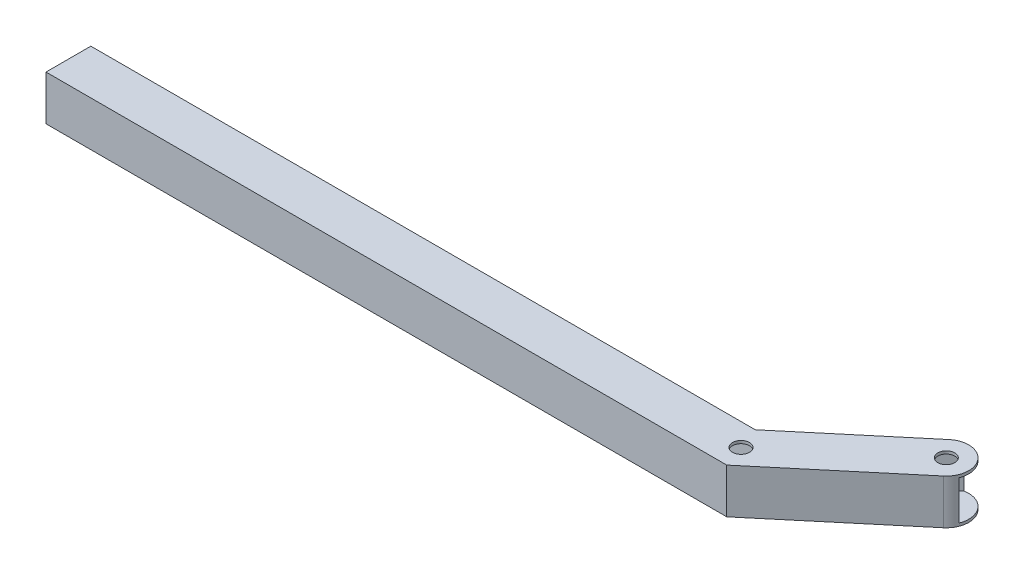
ISO-10303-21;
HEADER;
FILE_DESCRIPTION(('STEP AP214'),'2;1');
FILE_NAME('part.step','',(''),(''),'','','');
FILE_SCHEMA(('AUTOMOTIVE_DESIGN { 1 0 10303 214 1 1 1 1 }'));
ENDSEC;
DATA;
#1=APPLICATION_CONTEXT('core data for automotive mechanical design processes');
#2=APPLICATION_PROTOCOL_DEFINITION('international standard','automotive_design',2000,#1);
#3=PRODUCT_CONTEXT('',#1,'mechanical');
#4=PRODUCT('Part','Part','',(#3));
#5=PRODUCT_RELATED_PRODUCT_CATEGORY('part','',(#4));
#6=PRODUCT_DEFINITION_FORMATION('','',#4);
#7=PRODUCT_DEFINITION_CONTEXT('part definition',#1,'design');
#8=PRODUCT_DEFINITION('design','',#6,#7);
#9=PRODUCT_DEFINITION_SHAPE('','',#8);
#10=(LENGTH_UNIT() NAMED_UNIT(*) SI_UNIT(.MILLI.,.METRE.));
#11=(NAMED_UNIT(*) PLANE_ANGLE_UNIT() SI_UNIT($,.RADIAN.));
#12=(NAMED_UNIT(*) SI_UNIT($,.STERADIAN.) SOLID_ANGLE_UNIT());
#13=UNCERTAINTY_MEASURE_WITH_UNIT(LENGTH_MEASURE(1.E-05),#10,'distance_accuracy_value','');
#14=(GEOMETRIC_REPRESENTATION_CONTEXT(3) GLOBAL_UNCERTAINTY_ASSIGNED_CONTEXT((#13)) GLOBAL_UNIT_ASSIGNED_CONTEXT((#10,
#11,#12)) REPRESENTATION_CONTEXT('',''));
#15=CARTESIAN_POINT('',(0.,0.,0.));
#16=DIRECTION('',(0.,0.,1.));
#17=DIRECTION('',(1.,0.,0.));
#18=AXIS2_PLACEMENT_3D('',#15,#16,#17);
#19=CARTESIAN_POINT('',(390.488969144889,1.5875,-76.929763444575));
#20=DIRECTION('',(0.,-1.,0.));
#21=DIRECTION('',(0.,0.,-1.));
#22=AXIS2_PLACEMENT_3D('',#19,#20,#21);
#23=PLANE('',#22);
#24=CARTESIAN_POINT('',(390.488969144889,1.5875,-76.929763444575));
#25=DIRECTION('',(0.,-1.,0.));
#26=DIRECTION('',(0.,0.,-1.));
#27=AXIS2_PLACEMENT_3D('',#24,#25,#26);
#28=CIRCLE('',#27,4.82599999999999);
#29=CARTESIAN_POINT('',(390.488969144889,1.5875,-81.755763444575));
#30=VERTEX_POINT('',#29);
#31=EDGE_CURVE('E386',#30,#30,#28,.T.);
#32=ORIENTED_EDGE('',*,*,#31,.T.);
#33=EDGE_LOOP('',(#32));
#34=FACE_BOUND('',#33,.T.);
#35=CARTESIAN_POINT('',(327.252000365417,1.5875,-23.8676462649511));
#36=DIRECTION('',(0.,-1.,0.));
#37=DIRECTION('',(0.,0.,-1.));
#38=AXIS2_PLACEMENT_3D('',#35,#36,#37);
#39=CIRCLE('',#38,4.82599999999999);
#40=CARTESIAN_POINT('',(327.252000365417,1.5875,-28.693646264951));
#41=VERTEX_POINT('',#40);
#42=EDGE_CURVE('E175',#41,#41,#39,.T.);
#43=ORIENTED_EDGE('',*,*,#42,.T.);
#44=EDGE_LOOP('',(#43));
#45=FACE_BOUND('',#44,.T.);
#46=DIRECTION('',(-1.,0.,0.));
#47=VECTOR('',#46,1.);
#48=CARTESIAN_POINT('',(-53.7479996345851,1.5875,-12.755146264951));
#49=LINE('',#48,#47);
#50=CARTESIAN_POINT('',(330.542351676102,1.5875,-12.755146264951));
#51=VERTEX_POINT('',#50);
#52=CARTESIAN_POINT('',(-53.7479996345827,1.5875,-12.755146264951));
#53=VERTEX_POINT('',#52);
#54=EDGE_CURVE('E51',#51,#53,#49,.T.);
#55=ORIENTED_EDGE('',*,*,#54,.F.);
#56=DIRECTION('',(-0.642787609686615,0.,-0.766044443118915));
#57=VECTOR('',#56,1.);
#58=CARTESIAN_POINT('',(330.542351676102,1.5875,-12.755146264951));
#59=LINE('',#58,#57);
#60=CARTESIAN_POINT('',(330.853997010219,1.5875,-12.3837418184018));
#61=VERTEX_POINT('',#60);
#62=EDGE_CURVE('E55',#61,#51,#59,.T.);
#63=ORIENTED_EDGE('',*,*,#62,.F.);
#64=DIRECTION('',(-0.766044443118914,0.,0.642787609686616));
#65=VECTOR('',#64,1.);
#66=CARTESIAN_POINT('',(330.853997010219,1.5875,-12.3837418184018));
#67=LINE('',#66,#65);
#68=CARTESIAN_POINT('',(331.2966195937,1.5875,-12.755146264951));
#69=VERTEX_POINT('',#68);
#70=EDGE_CURVE('E213',#69,#61,#67,.T.);
#71=ORIENTED_EDGE('',*,*,#70,.F.);
#72=DIRECTION('',(-1.,0.,0.));
#73=VECTOR('',#72,1.);
#74=CARTESIAN_POINT('',(331.2966195937,1.5875,-12.755146264951));
#75=LINE('',#74,#73);
#76=CARTESIAN_POINT('',(331.874422340594,1.5875,-12.755146264951));
#77=VERTEX_POINT('',#76);
#78=EDGE_CURVE('E210',#77,#69,#75,.T.);
#79=ORIENTED_EDGE('',*,*,#78,.F.);
#80=DIRECTION('',(0.,0.,1.));
#81=VECTOR('',#80,1.);
#82=CARTESIAN_POINT('',(331.874422340594,1.5875,-12.755146264951));
#83=LINE('',#82,#81);
#84=CARTESIAN_POINT('',(331.874422340594,1.5875,-13.2399803367638));
#85=VERTEX_POINT('',#84);
#86=EDGE_CURVE('E185',#85,#77,#83,.T.);
#87=ORIENTED_EDGE('',*,*,#86,.F.);
#88=DIRECTION('',(-0.766044443118915,0.,0.642787609686614));
#89=VECTOR('',#88,1.);
#90=CARTESIAN_POINT('',(331.874422340594,1.5875,-13.2399803367638));
#91=LINE('',#90,#89);
#92=CARTESIAN_POINT('',(402.341864357516,1.5875,-72.3691849431811));
#93=VERTEX_POINT('',#92);
#94=EDGE_CURVE('E192',#93,#85,#91,.T.);
#95=ORIENTED_EDGE('',*,*,#94,.F.);
#96=CARTESIAN_POINT('',(390.488969144889,1.5875,-76.929763444575));
#97=DIRECTION('',(0.,1.,0.));
#98=DIRECTION('',(0.,0.,-1.));
#99=AXIS2_PLACEMENT_3D('',#96,#97,#98);
#100=CIRCLE('',#99,12.7000000468073);
#101=CARTESIAN_POINT('',(388.055909732222,1.5875,-89.3945226914815));
#102=VERTEX_POINT('',#101);
#103=EDGE_CURVE('E260',#93,#102,#100,.T.);
#104=ORIENTED_EDGE('',*,*,#103,.T.);
#105=DIRECTION('',(0.766044443118977,0.,-0.642787609686541));
#106=VECTOR('',#105,1.);
#107=CARTESIAN_POINT('',(388.055909658162,1.5875,-89.3945226293371));
#108=LINE('',#107,#106);
#109=CARTESIAN_POINT('',(323.207381137134,1.5875,-34.9801462649537));
#110=VERTEX_POINT('',#109);
#111=EDGE_CURVE('E239',#110,#102,#108,.T.);
#112=ORIENTED_EDGE('',*,*,#111,.F.);
#113=DIRECTION('',(1.,0.,0.));
#114=VECTOR('',#113,1.);
#115=CARTESIAN_POINT('',(323.207381137134,1.5875,-34.9801462649537));
#116=LINE('',#115,#114);
#117=CARTESIAN_POINT('',(-53.7479996345827,1.5875,-34.9801462649537));
#118=VERTEX_POINT('',#117);
#119=EDGE_CURVE('E244',#118,#110,#116,.T.);
#120=ORIENTED_EDGE('',*,*,#119,.F.);
#121=DIRECTION('',(0.,0.,1.));
#122=VECTOR('',#121,1.);
#123=CARTESIAN_POINT('',(-53.7479996345827,1.5875,-11.167646264951));
#124=LINE('',#123,#122);
#125=EDGE_CURVE('E262',#118,#53,#124,.T.);
#126=ORIENTED_EDGE('',*,*,#125,.T.);
#127=EDGE_LOOP('',(#55,#63,#71,#79,#87,#95,#104,#112,#120,#126));
#128=FACE_BOUND('',#127,.T.);
#129=ADVANCED_FACE('F36',(#34,#45,#128),#23,.F.);
#130=CARTESIAN_POINT('',(390.488969144889,1.5875,-76.929763444575));
#131=DIRECTION('',(0.,-1.,0.));
#132=DIRECTION('',(0.,0.,-1.));
#133=AXIS2_PLACEMENT_3D('',#130,#131,#132);
#134=CYLINDRICAL_SURFACE('',#133,12.7000000468073);
#135=DIRECTION('',(0.,-1.,0.));
#136=VECTOR('',#135,1.);
#137=CARTESIAN_POINT('',(382.325566471783,1.5875,-86.6585279080425));
#138=LINE('',#137,#136);
#139=CARTESIAN_POINT('',(382.325566471783,25.4,-86.6585279080425));
#140=VERTEX_POINT('',#139);
#141=CARTESIAN_POINT('',(382.325566471783,0.,-86.6585279080425));
#142=VERTEX_POINT('',#141);
#143=EDGE_CURVE('E11',#140,#142,#138,.T.);
#144=ORIENTED_EDGE('',*,*,#143,.F.);
#145=CARTESIAN_POINT('',(390.488969144889,25.4,-76.929763444575));
#146=DIRECTION('',(0.,1.,0.));
#147=DIRECTION('',(0.,0.,-1.));
#148=AXIS2_PLACEMENT_3D('',#145,#146,#147);
#149=CIRCLE('',#148,12.7000000468073);
#150=CARTESIAN_POINT('',(398.652371817995,25.4,-67.2009989811076));
#151=VERTEX_POINT('',#150);
#152=EDGE_CURVE('E151',#151,#140,#149,.T.);
#153=ORIENTED_EDGE('',*,*,#152,.F.);
#154=DIRECTION('',(0.,-1.,0.));
#155=VECTOR('',#154,1.);
#156=CARTESIAN_POINT('',(398.652371817995,1.5875,-67.2009989811076));
#157=LINE('',#156,#155);
#158=CARTESIAN_POINT('',(398.652371817995,0.,-67.2009989811076));
#159=VERTEX_POINT('',#158);
#160=EDGE_CURVE('E265',#151,#159,#157,.T.);
#161=ORIENTED_EDGE('',*,*,#160,.T.);
#162=CARTESIAN_POINT('',(390.488969144889,0.,-76.929763444575));
#163=DIRECTION('',(0.,1.,0.));
#164=DIRECTION('',(0.,0.,-1.));
#165=AXIS2_PLACEMENT_3D('',#162,#163,#164);
#166=CIRCLE('',#165,12.7000000468073);
#167=EDGE_CURVE('E153',#159,#142,#166,.T.);
#168=ORIENTED_EDGE('',*,*,#167,.T.);
#169=EDGE_LOOP('',(#144,#153,#161,#168));
#170=FACE_BOUND('',#169,.T.);
#171=CARTESIAN_POINT('',(390.488969144889,23.8125,-76.929763444575));
#172=DIRECTION('',(0.,1.,0.));
#173=DIRECTION('',(0.,0.,-1.));
#174=AXIS2_PLACEMENT_3D('',#171,#172,#173);
#175=CIRCLE('',#174,12.7000000468073);
#176=CARTESIAN_POINT('',(402.341864283442,23.8125,-72.3691848810253));
#177=VERTEX_POINT('',#176);
#178=CARTESIAN_POINT('',(388.055909658162,23.8125,-89.3945226293371));
#179=VERTEX_POINT('',#178);
#180=EDGE_CURVE('E172',#177,#179,#175,.T.);
#181=ORIENTED_EDGE('',*,*,#180,.T.);
#182=DIRECTION('',(0.,-1.,0.));
#183=VECTOR('',#182,1.);
#184=CARTESIAN_POINT('',(388.055909658162,23.8125,-89.3945226293371));
#185=LINE('',#184,#183);
#186=EDGE_CURVE('E257',#179,#102,#185,.T.);
#187=ORIENTED_EDGE('',*,*,#186,.T.);
#188=ORIENTED_EDGE('',*,*,#103,.F.);
#189=DIRECTION('',(0.,-1.,0.));
#190=VECTOR('',#189,1.);
#191=CARTESIAN_POINT('',(402.341864283442,23.8125,-72.3691848810253));
#192=LINE('',#191,#190);
#193=EDGE_CURVE('E221',#177,#93,#192,.T.);
#194=ORIENTED_EDGE('',*,*,#193,.F.);
#195=EDGE_LOOP('',(#181,#187,#188,#194));
#196=FACE_BOUND('',#195,.T.);
#197=ADVANCED_FACE('F38',(#170,#196),#134,.T.);
#198=CARTESIAN_POINT('',(322.629578317417,1.5875,-36.567646264951));
#199=DIRECTION('',(0.642787609686541,0.,0.766044443118976));
#200=DIRECTION('',(0.766044443118977,0.,-0.642787609686541));
#201=AXIS2_PLACEMENT_3D('',#198,#199,#200);
#202=PLANE('',#201);
#203=DIRECTION('',(-0.766044443118977,0.,0.642787609686541));
#204=VECTOR('',#203,1.);
#205=CARTESIAN_POINT('',(322.629578317417,0.,-36.567646264951));
#206=LINE('',#205,#204);
#207=CARTESIAN_POINT('',(322.629578317417,0.,-36.567646264951));
#208=VERTEX_POINT('',#207);
#209=EDGE_CURVE('E267',#142,#208,#206,.T.);
#210=ORIENTED_EDGE('',*,*,#209,.T.);
#211=DIRECTION('',(0.,-1.,0.));
#212=VECTOR('',#211,1.);
#213=CARTESIAN_POINT('',(322.629578317417,1.5875,-36.567646264951));
#214=LINE('',#213,#212);
#215=CARTESIAN_POINT('',(322.629578317417,25.4,-36.567646264951));
#216=VERTEX_POINT('',#215);
#217=EDGE_CURVE('E44',#216,#208,#214,.T.);
#218=ORIENTED_EDGE('',*,*,#217,.F.);
#219=DIRECTION('',(-0.766044443118976,0.,0.642787609686541));
#220=VECTOR('',#219,1.);
#221=CARTESIAN_POINT('',(322.629578317417,25.4,-36.567646264951));
#222=LINE('',#221,#220);
#223=EDGE_CURVE('E156',#140,#216,#222,.T.);
#224=ORIENTED_EDGE('',*,*,#223,.F.);
#225=ORIENTED_EDGE('',*,*,#143,.T.);
#226=EDGE_LOOP('',(#210,#218,#224,#225));
#227=FACE_BOUND('',#226,.T.);
#228=ADVANCED_FACE('F157',(#227),#202,.F.);
#229=CARTESIAN_POINT('',(-53.7479996345827,1.5875,-36.567646264951));
#230=DIRECTION('',(0.,0.,1.));
#231=DIRECTION('',(1.,0.,0.));
#232=AXIS2_PLACEMENT_3D('',#229,#230,#231);
#233=PLANE('',#232);
#234=DIRECTION('',(-1.,0.,0.));
#235=VECTOR('',#234,1.);
#236=CARTESIAN_POINT('',(-53.7479996345827,0.,-36.567646264951));
#237=LINE('',#236,#235);
#238=CARTESIAN_POINT('',(-53.7479996345827,0.,-36.567646264951));
#239=VERTEX_POINT('',#238);
#240=EDGE_CURVE('E269',#208,#239,#237,.T.);
#241=ORIENTED_EDGE('',*,*,#240,.T.);
#242=DIRECTION('',(0.,-1.,0.));
#243=VECTOR('',#242,1.);
#244=CARTESIAN_POINT('',(-53.7479996345827,1.5875,-36.567646264951));
#245=LINE('',#244,#243);
#246=CARTESIAN_POINT('',(-53.7479996345827,25.4,-36.567646264951));
#247=VERTEX_POINT('',#246);
#248=EDGE_CURVE('E283',#247,#239,#245,.T.);
#249=ORIENTED_EDGE('',*,*,#248,.F.);
#250=DIRECTION('',(-1.,0.,0.));
#251=VECTOR('',#250,1.);
#252=CARTESIAN_POINT('',(-53.7479996345827,25.4,-36.567646264951));
#253=LINE('',#252,#251);
#254=EDGE_CURVE('E162',#216,#247,#253,.T.);
#255=ORIENTED_EDGE('',*,*,#254,.F.);
#256=ORIENTED_EDGE('',*,*,#217,.T.);
#257=EDGE_LOOP('',(#241,#249,#255,#256));
#258=FACE_BOUND('',#257,.T.);
#259=ADVANCED_FACE('F287',(#258),#233,.F.);
#260=CARTESIAN_POINT('',(-53.7479996345827,1.5875,-11.167646264951));
#261=DIRECTION('',(1.,0.,0.));
#262=DIRECTION('',(0.,0.,-1.));
#263=AXIS2_PLACEMENT_3D('',#260,#261,#262);
#264=PLANE('',#263);
#265=DIRECTION('',(0.,-1.,0.));
#266=VECTOR('',#265,1.);
#267=CARTESIAN_POINT('',(-53.7479996345828,23.8125,-34.9801462649537));
#268=LINE('',#267,#266);
#269=CARTESIAN_POINT('',(-53.7479996345827,23.8125,-34.9801462649537));
#270=VERTEX_POINT('',#269);
#271=EDGE_CURVE('E254',#270,#118,#268,.T.);
#272=ORIENTED_EDGE('',*,*,#271,.F.);
#273=DIRECTION('',(0.,0.,1.));
#274=VECTOR('',#273,1.);
#275=CARTESIAN_POINT('',(-53.7479996345827,23.8125,-11.167646264951));
#276=LINE('',#275,#274);
#277=CARTESIAN_POINT('',(-53.7479996345851,23.8125,-12.755146264951));
#278=VERTEX_POINT('',#277);
#279=EDGE_CURVE('E169',#270,#278,#276,.T.);
#280=ORIENTED_EDGE('',*,*,#279,.T.);
#281=DIRECTION('',(0.,-1.,0.));
#282=VECTOR('',#281,1.);
#283=CARTESIAN_POINT('',(-53.7479996345851,23.8125,-12.755146264951));
#284=LINE('',#283,#282);
#285=EDGE_CURVE('E224',#278,#53,#284,.T.);
#286=ORIENTED_EDGE('',*,*,#285,.T.);
#287=ORIENTED_EDGE('',*,*,#125,.F.);
#288=EDGE_LOOP('',(#272,#280,#286,#287));
#289=FACE_BOUND('',#288,.T.);
#290=DIRECTION('',(0.,0.,1.));
#291=VECTOR('',#290,1.);
#292=CARTESIAN_POINT('',(-53.7479996345827,0.,-11.167646264951));
#293=LINE('',#292,#291);
#294=CARTESIAN_POINT('',(-53.7479996345827,0.,-11.167646264951));
#295=VERTEX_POINT('',#294);
#296=EDGE_CURVE('E271',#239,#295,#293,.T.);
#297=ORIENTED_EDGE('',*,*,#296,.T.);
#298=DIRECTION('',(0.,-1.,0.));
#299=VECTOR('',#298,1.);
#300=CARTESIAN_POINT('',(-53.7479996345827,1.5875,-11.167646264951));
#301=LINE('',#300,#299);
#302=CARTESIAN_POINT('',(-53.7479996345827,25.4,-11.167646264951));
#303=VERTEX_POINT('',#302);
#304=EDGE_CURVE('E280',#303,#295,#301,.T.);
#305=ORIENTED_EDGE('',*,*,#304,.F.);
#306=DIRECTION('',(0.,0.,1.));
#307=VECTOR('',#306,1.);
#308=CARTESIAN_POINT('',(-53.7479996345827,25.4,-11.167646264951));
#309=LINE('',#308,#307);
#310=EDGE_CURVE('E179',#247,#303,#309,.T.);
#311=ORIENTED_EDGE('',*,*,#310,.F.);
#312=ORIENTED_EDGE('',*,*,#248,.T.);
#313=EDGE_LOOP('',(#297,#305,#311,#312));
#314=FACE_BOUND('',#313,.T.);
#315=ADVANCED_FACE('F294',(#289,#314),#264,.F.);
#316=CARTESIAN_POINT('',(331.874422413417,1.5875,-11.1676462649511));
#317=DIRECTION('',(0.,0.,-1.));
#318=DIRECTION('',(-1.,0.,0.));
#319=AXIS2_PLACEMENT_3D('',#316,#317,#318);
#320=PLANE('',#319);
#321=DIRECTION('',(1.,0.,0.));
#322=VECTOR('',#321,1.);
#323=CARTESIAN_POINT('',(331.874422413417,0.,-11.1676462649511));
#324=LINE('',#323,#322);
#325=CARTESIAN_POINT('',(331.874422413417,0.,-11.1676462649511));
#326=VERTEX_POINT('',#325);
#327=EDGE_CURVE('E273',#295,#326,#324,.T.);
#328=ORIENTED_EDGE('',*,*,#327,.T.);
#329=DIRECTION('',(0.,-1.,0.));
#330=VECTOR('',#329,1.);
#331=CARTESIAN_POINT('',(331.874422413417,1.5875,-11.1676462649511));
#332=LINE('',#331,#330);
#333=CARTESIAN_POINT('',(331.874422413417,25.4,-11.1676462649511));
#334=VERTEX_POINT('',#333);
#335=EDGE_CURVE('E277',#334,#326,#332,.T.);
#336=ORIENTED_EDGE('',*,*,#335,.F.);
#337=DIRECTION('',(1.,0.,0.));
#338=VECTOR('',#337,1.);
#339=CARTESIAN_POINT('',(331.874422413417,25.4,-11.1676462649511));
#340=LINE('',#339,#338);
#341=EDGE_CURVE('E182',#303,#334,#340,.T.);
#342=ORIENTED_EDGE('',*,*,#341,.F.);
#343=ORIENTED_EDGE('',*,*,#304,.T.);
#344=EDGE_LOOP('',(#328,#336,#342,#343));
#345=FACE_BOUND('',#344,.T.);
#346=ADVANCED_FACE('F298',(#345),#320,.F.);
#347=CARTESIAN_POINT('',(331.874422413417,1.5875,-11.1676462649511));
#348=DIRECTION('',(-0.642787609686541,0.,-0.766044443118976));
#349=DIRECTION('',(-0.766044443118977,0.,0.642787609686541));
#350=AXIS2_PLACEMENT_3D('',#347,#348,#349);
#351=PLANE('',#350);
#352=DIRECTION('',(0.766044443118976,0.,-0.642787609686541));
#353=VECTOR('',#352,1.);
#354=CARTESIAN_POINT('',(331.874422413417,0.,-11.1676462649511));
#355=LINE('',#354,#353);
#356=EDGE_CURVE('E263',#326,#159,#355,.T.);
#357=ORIENTED_EDGE('',*,*,#356,.T.);
#358=ORIENTED_EDGE('',*,*,#160,.F.);
#359=DIRECTION('',(0.766044443118977,0.,-0.642787609686541));
#360=VECTOR('',#359,1.);
#361=CARTESIAN_POINT('',(331.874422413417,25.4,-11.1676462649511));
#362=LINE('',#361,#360);
#363=EDGE_CURVE('E168',#334,#151,#362,.T.);
#364=ORIENTED_EDGE('',*,*,#363,.F.);
#365=ORIENTED_EDGE('',*,*,#335,.T.);
#366=EDGE_LOOP('',(#357,#358,#364,#365));
#367=FACE_BOUND('',#366,.T.);
#368=ADVANCED_FACE('F300',(#367),#351,.F.);
#369=CARTESIAN_POINT('',(390.488969144889,0.,-76.929763444575));
#370=DIRECTION('',(0.,-1.,0.));
#371=DIRECTION('',(0.,0.,-1.));
#372=AXIS2_PLACEMENT_3D('',#369,#370,#371);
#373=PLANE('',#372);
#374=CARTESIAN_POINT('',(390.488969144889,0.,-76.929763444575));
#375=DIRECTION('',(0.,1.,0.));
#376=DIRECTION('',(0.,0.,1.));
#377=AXIS2_PLACEMENT_3D('',#374,#375,#376);
#378=CIRCLE('',#377,4.82599999999999);
#379=CARTESIAN_POINT('',(390.488969144889,0.,-72.1037634445751));
#380=VERTEX_POINT('',#379);
#381=EDGE_CURVE('E380',#380,#380,#378,.T.);
#382=ORIENTED_EDGE('',*,*,#381,.T.);
#383=EDGE_LOOP('',(#382));
#384=FACE_BOUND('',#383,.T.);
#385=CARTESIAN_POINT('',(327.252000365417,0.,-23.8676462649511));
#386=DIRECTION('',(0.,1.,0.));
#387=DIRECTION('',(0.,0.,1.));
#388=AXIS2_PLACEMENT_3D('',#385,#386,#387);
#389=CIRCLE('',#388,4.82599999999999);
#390=CARTESIAN_POINT('',(327.252000365417,0.,-19.0416462649511));
#391=VERTEX_POINT('',#390);
#392=EDGE_CURVE('E389',#391,#391,#389,.T.);
#393=ORIENTED_EDGE('',*,*,#392,.T.);
#394=EDGE_LOOP('',(#393));
#395=FACE_BOUND('',#394,.T.);
#396=ORIENTED_EDGE('',*,*,#167,.F.);
#397=ORIENTED_EDGE('',*,*,#356,.F.);
#398=ORIENTED_EDGE('',*,*,#327,.F.);
#399=ORIENTED_EDGE('',*,*,#296,.F.);
#400=ORIENTED_EDGE('',*,*,#240,.F.);
#401=ORIENTED_EDGE('',*,*,#209,.F.);
#402=EDGE_LOOP('',(#396,#397,#398,#399,#400,#401));
#403=FACE_BOUND('',#402,.T.);
#404=ADVANCED_FACE('F290',(#384,#395,#403),#373,.T.);
#405=CARTESIAN_POINT('',(388.055909658162,23.8125,-89.3945226293371));
#406=DIRECTION('',(-0.642787609686541,0.,-0.766044443118977));
#407=DIRECTION('',(-0.766044443118977,0.,0.642787609686541));
#408=AXIS2_PLACEMENT_3D('',#405,#406,#407);
#409=PLANE('',#408);
#410=ORIENTED_EDGE('',*,*,#111,.T.);
#411=ORIENTED_EDGE('',*,*,#186,.F.);
#412=DIRECTION('',(0.766044443118977,0.,-0.642787609686541));
#413=VECTOR('',#412,1.);
#414=CARTESIAN_POINT('',(388.055909658162,23.8125,-89.3945226293371));
#415=LINE('',#414,#413);
#416=CARTESIAN_POINT('',(323.207381137134,23.8125,-34.9801462649537));
#417=VERTEX_POINT('',#416);
#418=EDGE_CURVE('E240',#417,#179,#415,.T.);
#419=ORIENTED_EDGE('',*,*,#418,.F.);
#420=DIRECTION('',(0.,-1.,0.));
#421=VECTOR('',#420,1.);
#422=CARTESIAN_POINT('',(323.207381137134,23.8125,-34.9801462649537));
#423=LINE('',#422,#421);
#424=EDGE_CURVE('E247',#417,#110,#423,.T.);
#425=ORIENTED_EDGE('',*,*,#424,.T.);
#426=EDGE_LOOP('',(#410,#411,#419,#425));
#427=FACE_BOUND('',#426,.T.);
#428=ADVANCED_FACE('F307',(#427),#409,.F.);
#429=CARTESIAN_POINT('',(323.207381137134,23.8125,-34.9801462649537));
#430=DIRECTION('',(0.,0.,-1.));
#431=DIRECTION('',(-1.,0.,0.));
#432=AXIS2_PLACEMENT_3D('',#429,#430,#431);
#433=PLANE('',#432);
#434=ORIENTED_EDGE('',*,*,#119,.T.);
#435=ORIENTED_EDGE('',*,*,#424,.F.);
#436=DIRECTION('',(1.,0.,0.));
#437=VECTOR('',#436,1.);
#438=CARTESIAN_POINT('',(323.207381137134,23.8125,-34.9801462649537));
#439=LINE('',#438,#437);
#440=EDGE_CURVE('E243',#270,#417,#439,.T.);
#441=ORIENTED_EDGE('',*,*,#440,.F.);
#442=ORIENTED_EDGE('',*,*,#271,.T.);
#443=EDGE_LOOP('',(#434,#435,#441,#442));
#444=FACE_BOUND('',#443,.T.);
#445=ADVANCED_FACE('F322',(#444),#433,.F.);
#446=CARTESIAN_POINT('',(331.874422340594,23.8125,-12.755146264951));
#447=DIRECTION('',(1.,0.,0.));
#448=DIRECTION('',(0.,0.,-1.));
#449=AXIS2_PLACEMENT_3D('',#446,#447,#448);
#450=PLANE('',#449);
#451=ORIENTED_EDGE('',*,*,#86,.T.);
#452=DIRECTION('',(0.,-1.,0.));
#453=VECTOR('',#452,1.);
#454=CARTESIAN_POINT('',(331.874422340594,23.8125,-12.755146264951));
#455=LINE('',#454,#453);
#456=CARTESIAN_POINT('',(331.874422340594,23.8125,-12.755146264951));
#457=VERTEX_POINT('',#456);
#458=EDGE_CURVE('E236',#457,#77,#455,.T.);
#459=ORIENTED_EDGE('',*,*,#458,.F.);
#460=DIRECTION('',(0.,0.,1.));
#461=VECTOR('',#460,1.);
#462=CARTESIAN_POINT('',(331.874422340594,23.8125,-12.755146264951));
#463=LINE('',#462,#461);
#464=CARTESIAN_POINT('',(331.874422340594,23.8125,-13.2399803367638));
#465=VERTEX_POINT('',#464);
#466=EDGE_CURVE('E188',#465,#457,#463,.T.);
#467=ORIENTED_EDGE('',*,*,#466,.F.);
#468=DIRECTION('',(0.,-1.,0.));
#469=VECTOR('',#468,1.);
#470=CARTESIAN_POINT('',(331.874422340594,23.8125,-13.2399803367638));
#471=LINE('',#470,#469);
#472=EDGE_CURVE('E207',#465,#85,#471,.T.);
#473=ORIENTED_EDGE('',*,*,#472,.T.);
#474=EDGE_LOOP('',(#451,#459,#467,#473));
#475=FACE_BOUND('',#474,.T.);
#476=ADVANCED_FACE('F326',(#475),#450,.F.);
#477=CARTESIAN_POINT('',(331.2966195937,23.8125,-12.755146264951));
#478=DIRECTION('',(0.,0.,1.));
#479=DIRECTION('',(1.,0.,0.));
#480=AXIS2_PLACEMENT_3D('',#477,#478,#479);
#481=PLANE('',#480);
#482=ORIENTED_EDGE('',*,*,#78,.T.);
#483=DIRECTION('',(0.,-1.,0.));
#484=VECTOR('',#483,1.);
#485=CARTESIAN_POINT('',(331.2966195937,23.8125,-12.755146264951));
#486=LINE('',#485,#484);
#487=CARTESIAN_POINT('',(331.2966195937,23.8125,-12.755146264951));
#488=VERTEX_POINT('',#487);
#489=EDGE_CURVE('E233',#488,#69,#486,.T.);
#490=ORIENTED_EDGE('',*,*,#489,.F.);
#491=DIRECTION('',(-1.,0.,0.));
#492=VECTOR('',#491,1.);
#493=CARTESIAN_POINT('',(331.2966195937,23.8125,-12.755146264951));
#494=LINE('',#493,#492);
#495=EDGE_CURVE('E191',#457,#488,#494,.T.);
#496=ORIENTED_EDGE('',*,*,#495,.F.);
#497=ORIENTED_EDGE('',*,*,#458,.T.);
#498=EDGE_LOOP('',(#482,#490,#496,#497));
#499=FACE_BOUND('',#498,.T.);
#500=ADVANCED_FACE('F330',(#499),#481,.F.);
#501=CARTESIAN_POINT('',(330.853997010219,23.8125,-12.3837418184018));
#502=DIRECTION('',(0.642787609686616,0.,0.766044443118914));
#503=DIRECTION('',(0.766044443118914,0.,-0.642787609686616));
#504=AXIS2_PLACEMENT_3D('',#501,#502,#503);
#505=PLANE('',#504);
#506=ORIENTED_EDGE('',*,*,#70,.T.);
#507=DIRECTION('',(0.,-1.,0.));
#508=VECTOR('',#507,1.);
#509=CARTESIAN_POINT('',(330.853997010219,23.8125,-12.3837418184018));
#510=LINE('',#509,#508);
#511=CARTESIAN_POINT('',(330.853997010219,23.8125,-12.3837418184018));
#512=VERTEX_POINT('',#511);
#513=EDGE_CURVE('E230',#512,#61,#510,.T.);
#514=ORIENTED_EDGE('',*,*,#513,.F.);
#515=DIRECTION('',(-0.766044443118914,0.,0.642787609686616));
#516=VECTOR('',#515,1.);
#517=CARTESIAN_POINT('',(330.853997010219,23.8125,-12.3837418184018));
#518=LINE('',#517,#516);
#519=EDGE_CURVE('E195',#488,#512,#518,.T.);
#520=ORIENTED_EDGE('',*,*,#519,.F.);
#521=ORIENTED_EDGE('',*,*,#489,.T.);
#522=EDGE_LOOP('',(#506,#514,#520,#521));
#523=FACE_BOUND('',#522,.T.);
#524=ADVANCED_FACE('F334',(#523),#505,.F.);
#525=CARTESIAN_POINT('',(330.542351676102,23.8125,-12.755146264951));
#526=DIRECTION('',(-0.766044443118915,0.,0.642787609686615));
#527=DIRECTION('',(0.642787609686615,0.,0.766044443118915));
#528=AXIS2_PLACEMENT_3D('',#525,#526,#527);
#529=PLANE('',#528);
#530=ORIENTED_EDGE('',*,*,#62,.T.);
#531=DIRECTION('',(0.,-1.,0.));
#532=VECTOR('',#531,1.);
#533=CARTESIAN_POINT('',(330.542351676102,23.8125,-12.755146264951));
#534=LINE('',#533,#532);
#535=CARTESIAN_POINT('',(330.542351676102,23.8125,-12.755146264951));
#536=VERTEX_POINT('',#535);
#537=EDGE_CURVE('E227',#536,#51,#534,.T.);
#538=ORIENTED_EDGE('',*,*,#537,.F.);
#539=DIRECTION('',(-0.642787609686615,0.,-0.766044443118915));
#540=VECTOR('',#539,1.);
#541=CARTESIAN_POINT('',(330.542351676102,23.8125,-12.755146264951));
#542=LINE('',#541,#540);
#543=EDGE_CURVE('E198',#512,#536,#542,.T.);
#544=ORIENTED_EDGE('',*,*,#543,.F.);
#545=ORIENTED_EDGE('',*,*,#513,.T.);
#546=EDGE_LOOP('',(#530,#538,#544,#545));
#547=FACE_BOUND('',#546,.T.);
#548=ADVANCED_FACE('F338',(#547),#529,.F.);
#549=CARTESIAN_POINT('',(-53.7479996345851,23.8125,-12.755146264951));
#550=DIRECTION('',(0.,0.,1.));
#551=DIRECTION('',(1.,0.,0.));
#552=AXIS2_PLACEMENT_3D('',#549,#550,#551);
#553=PLANE('',#552);
#554=ORIENTED_EDGE('',*,*,#54,.T.);
#555=ORIENTED_EDGE('',*,*,#285,.F.);
#556=DIRECTION('',(-1.,0.,0.));
#557=VECTOR('',#556,1.);
#558=CARTESIAN_POINT('',(-53.7479996345851,23.8125,-12.755146264951));
#559=LINE('',#558,#557);
#560=EDGE_CURVE('E201',#536,#278,#559,.T.);
#561=ORIENTED_EDGE('',*,*,#560,.F.);
#562=ORIENTED_EDGE('',*,*,#537,.T.);
#563=EDGE_LOOP('',(#554,#555,#561,#562));
#564=FACE_BOUND('',#563,.T.);
#565=ADVANCED_FACE('F342',(#564),#553,.F.);
#566=CARTESIAN_POINT('',(331.874422340594,23.8125,-13.2399803367638));
#567=DIRECTION('',(0.642787609686614,0.,0.766044443118915));
#568=DIRECTION('',(0.766044443118915,0.,-0.642787609686614));
#569=AXIS2_PLACEMENT_3D('',#566,#567,#568);
#570=PLANE('',#569);
#571=ORIENTED_EDGE('',*,*,#94,.T.);
#572=ORIENTED_EDGE('',*,*,#472,.F.);
#573=DIRECTION('',(-0.766044443118915,0.,0.642787609686614));
#574=VECTOR('',#573,1.);
#575=CARTESIAN_POINT('',(331.874422340594,23.8125,-13.2399803367638));
#576=LINE('',#575,#574);
#577=EDGE_CURVE('E204',#177,#465,#576,.T.);
#578=ORIENTED_EDGE('',*,*,#577,.F.);
#579=ORIENTED_EDGE('',*,*,#193,.T.);
#580=EDGE_LOOP('',(#571,#572,#578,#579));
#581=FACE_BOUND('',#580,.T.);
#582=ADVANCED_FACE('F346',(#581),#570,.F.);
#583=CARTESIAN_POINT('',(390.488969144889,23.8125,-76.929763444575));
#584=DIRECTION('',(0.,-1.,0.));
#585=DIRECTION('',(0.,0.,-1.));
#586=AXIS2_PLACEMENT_3D('',#583,#584,#585);
#587=PLANE('',#586);
#588=CARTESIAN_POINT('',(390.488969144889,23.8125,-76.929763444575));
#589=DIRECTION('',(0.,-1.,0.));
#590=DIRECTION('',(0.,0.,-1.));
#591=AXIS2_PLACEMENT_3D('',#588,#589,#590);
#592=CIRCLE('',#591,4.82599999999999);
#593=CARTESIAN_POINT('',(390.488969144889,23.8125,-81.755763444575));
#594=VERTEX_POINT('',#593);
#595=EDGE_CURVE('E376',#594,#594,#592,.T.);
#596=ORIENTED_EDGE('',*,*,#595,.F.);
#597=EDGE_LOOP('',(#596));
#598=FACE_BOUND('',#597,.T.);
#599=CARTESIAN_POINT('',(327.252000365417,23.8125,-23.8676462649511));
#600=DIRECTION('',(0.,-1.,0.));
#601=DIRECTION('',(0.,0.,-1.));
#602=AXIS2_PLACEMENT_3D('',#599,#600,#601);
#603=CIRCLE('',#602,4.82599999999999);
#604=CARTESIAN_POINT('',(327.252000365417,23.8125,-28.693646264951));
#605=VERTEX_POINT('',#604);
#606=EDGE_CURVE('E392',#605,#605,#603,.T.);
#607=ORIENTED_EDGE('',*,*,#606,.F.);
#608=EDGE_LOOP('',(#607));
#609=FACE_BOUND('',#608,.T.);
#610=ORIENTED_EDGE('',*,*,#418,.T.);
#611=ORIENTED_EDGE('',*,*,#180,.F.);
#612=ORIENTED_EDGE('',*,*,#577,.T.);
#613=ORIENTED_EDGE('',*,*,#466,.T.);
#614=ORIENTED_EDGE('',*,*,#495,.T.);
#615=ORIENTED_EDGE('',*,*,#519,.T.);
#616=ORIENTED_EDGE('',*,*,#543,.T.);
#617=ORIENTED_EDGE('',*,*,#560,.T.);
#618=ORIENTED_EDGE('',*,*,#279,.F.);
#619=ORIENTED_EDGE('',*,*,#440,.T.);
#620=EDGE_LOOP('',(#610,#611,#612,#613,#614,#615,#616,#617,#618,#619));
#621=FACE_BOUND('',#620,.T.);
#622=ADVANCED_FACE('F350',(#598,#609,#621),#587,.T.);
#623=CARTESIAN_POINT('',(390.488969144889,25.4,-76.929763444575));
#624=DIRECTION('',(0.,-1.,0.));
#625=DIRECTION('',(0.,0.,-1.));
#626=AXIS2_PLACEMENT_3D('',#623,#624,#625);
#627=PLANE('',#626);
#628=CARTESIAN_POINT('',(390.488969144889,25.4,-76.929763444575));
#629=DIRECTION('',(0.,1.,0.));
#630=DIRECTION('',(0.,0.,1.));
#631=AXIS2_PLACEMENT_3D('',#628,#629,#630);
#632=CIRCLE('',#631,4.82599999999999);
#633=CARTESIAN_POINT('',(390.488969144889,25.4,-72.1037634445751));
#634=VERTEX_POINT('',#633);
#635=EDGE_CURVE('E379',#634,#634,#632,.T.);
#636=ORIENTED_EDGE('',*,*,#635,.F.);
#637=EDGE_LOOP('',(#636));
#638=FACE_BOUND('',#637,.T.);
#639=CARTESIAN_POINT('',(327.252000365417,25.4,-23.8676462649511));
#640=DIRECTION('',(0.,1.,0.));
#641=DIRECTION('',(0.,0.,1.));
#642=AXIS2_PLACEMENT_3D('',#639,#640,#641);
#643=CIRCLE('',#642,4.82599999999999);
#644=CARTESIAN_POINT('',(327.252000365417,25.4,-19.0416462649511));
#645=VERTEX_POINT('',#644);
#646=EDGE_CURVE('E388',#645,#645,#643,.T.);
#647=ORIENTED_EDGE('',*,*,#646,.F.);
#648=EDGE_LOOP('',(#647));
#649=FACE_BOUND('',#648,.T.);
#650=ORIENTED_EDGE('',*,*,#152,.T.);
#651=ORIENTED_EDGE('',*,*,#223,.T.);
#652=ORIENTED_EDGE('',*,*,#254,.T.);
#653=ORIENTED_EDGE('',*,*,#310,.T.);
#654=ORIENTED_EDGE('',*,*,#341,.T.);
#655=ORIENTED_EDGE('',*,*,#363,.T.);
#656=EDGE_LOOP('',(#650,#651,#652,#653,#654,#655));
#657=FACE_BOUND('',#656,.T.);
#658=ADVANCED_FACE('F165',(#638,#649,#657),#627,.F.);
#659=CARTESIAN_POINT('',(327.252000365417,0.,-23.8676462649511));
#660=DIRECTION('',(0.,1.,0.));
#661=DIRECTION('',(0.,0.,1.));
#662=AXIS2_PLACEMENT_3D('',#659,#660,#661);
#663=CYLINDRICAL_SURFACE('',#662,4.82599999999999);
#664=ORIENTED_EDGE('',*,*,#606,.T.);
#665=EDGE_LOOP('',(#664));
#666=FACE_BOUND('',#665,.T.);
#667=ORIENTED_EDGE('',*,*,#646,.T.);
#668=EDGE_LOOP('',(#667));
#669=FACE_BOUND('',#668,.T.);
#670=ADVANCED_FACE('F357',(#666,#669),#663,.F.);
#671=ORIENTED_EDGE('',*,*,#392,.F.);
#672=EDGE_LOOP('',(#671));
#673=FACE_BOUND('',#672,.T.);
#674=ORIENTED_EDGE('',*,*,#42,.F.);
#675=EDGE_LOOP('',(#674));
#676=FACE_BOUND('',#675,.T.);
#677=ADVANCED_FACE('F361',(#673,#676),#663,.F.);
#678=CARTESIAN_POINT('',(390.488969144889,0.,-76.929763444575));
#679=DIRECTION('',(0.,1.,0.));
#680=DIRECTION('',(0.,0.,1.));
#681=AXIS2_PLACEMENT_3D('',#678,#679,#680);
#682=CYLINDRICAL_SURFACE('',#681,4.82599999999999);
#683=ORIENTED_EDGE('',*,*,#595,.T.);
#684=EDGE_LOOP('',(#683));
#685=FACE_BOUND('',#684,.T.);
#686=ORIENTED_EDGE('',*,*,#635,.T.);
#687=EDGE_LOOP('',(#686));
#688=FACE_BOUND('',#687,.T.);
#689=ADVANCED_FACE('F363',(#685,#688),#682,.F.);
#690=ORIENTED_EDGE('',*,*,#381,.F.);
#691=EDGE_LOOP('',(#690));
#692=FACE_BOUND('',#691,.T.);
#693=ORIENTED_EDGE('',*,*,#31,.F.);
#694=EDGE_LOOP('',(#693));
#695=FACE_BOUND('',#694,.T.);
#696=ADVANCED_FACE('F365',(#692,#695),#682,.F.);
#697=CLOSED_SHELL('',(#129,#197,#228,#259,#315,#346,#368,#404,#428,#445,#476,#500,#524,#548,
#565,#582,#622,#658,#670,#677,#689,#696));
#698=MANIFOLD_SOLID_BREP('B2',#697);
#699=ADVANCED_BREP_SHAPE_REPRESENTATION('',(#18,#698),#14);
#700=SHAPE_DEFINITION_REPRESENTATION(#9,#699);
ENDSEC;
END-ISO-10303-21;
